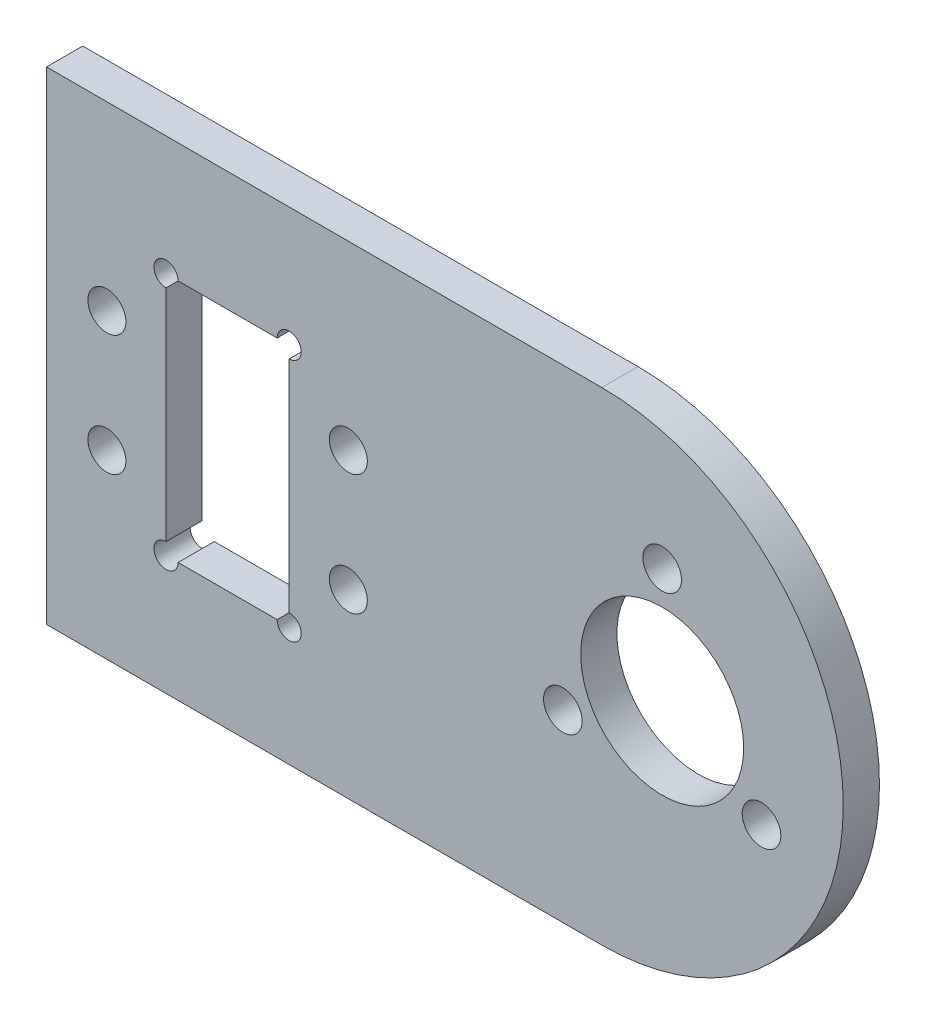
ISO-10303-21;
HEADER;
FILE_DESCRIPTION(('STEP AP214'),'2;1');
FILE_NAME('part.step','',(''),(''),'','','');
FILE_SCHEMA(('AUTOMOTIVE_DESIGN { 1 0 10303 214 1 1 1 1 }'));
ENDSEC;
DATA;
#1=APPLICATION_CONTEXT('core data for automotive mechanical design processes');
#2=APPLICATION_PROTOCOL_DEFINITION('international standard','automotive_design',2000,#1);
#3=PRODUCT_CONTEXT('',#1,'mechanical');
#4=PRODUCT('Part','Part','',(#3));
#5=PRODUCT_RELATED_PRODUCT_CATEGORY('part','',(#4));
#6=PRODUCT_DEFINITION_FORMATION('','',#4);
#7=PRODUCT_DEFINITION_CONTEXT('part definition',#1,'design');
#8=PRODUCT_DEFINITION('design','',#6,#7);
#9=PRODUCT_DEFINITION_SHAPE('','',#8);
#10=(LENGTH_UNIT() NAMED_UNIT(*) SI_UNIT(.MILLI.,.METRE.));
#11=(NAMED_UNIT(*) PLANE_ANGLE_UNIT() SI_UNIT($,.RADIAN.));
#12=(NAMED_UNIT(*) SI_UNIT($,.STERADIAN.) SOLID_ANGLE_UNIT());
#13=UNCERTAINTY_MEASURE_WITH_UNIT(LENGTH_MEASURE(1.E-05),#10,'distance_accuracy_value','');
#14=(GEOMETRIC_REPRESENTATION_CONTEXT(3) GLOBAL_UNCERTAINTY_ASSIGNED_CONTEXT((#13)) GLOBAL_UNIT_ASSIGNED_CONTEXT((#10,
#11,#12)) REPRESENTATION_CONTEXT('',''));
#15=CARTESIAN_POINT('',(0.,0.,0.));
#16=DIRECTION('',(0.,0.,1.));
#17=DIRECTION('',(1.,0.,0.));
#18=AXIS2_PLACEMENT_3D('',#15,#16,#17);
#19=CARTESIAN_POINT('',(0.,-20.,3.));
#20=DIRECTION('',(0.,0.,-1.));
#21=DIRECTION('',(-1.,0.,0.));
#22=AXIS2_PLACEMENT_3D('',#19,#20,#21);
#23=CYLINDRICAL_SURFACE('',#22,20.);
#24=CARTESIAN_POINT('',(0.,-20.,0.));
#25=DIRECTION('',(0.,0.,1.));
#26=DIRECTION('',(1.,0.,0.));
#27=AXIS2_PLACEMENT_3D('',#24,#25,#26);
#28=CIRCLE('',#27,20.);
#29=CARTESIAN_POINT('',(0.,-40.,0.));
#30=VERTEX_POINT('',#29);
#31=CARTESIAN_POINT('',(0.,0.,0.));
#32=VERTEX_POINT('',#31);
#33=EDGE_CURVE('E175',#30,#32,#28,.T.);
#34=ORIENTED_EDGE('',*,*,#33,.T.);
#35=DIRECTION('',(0.,0.,-1.));
#36=VECTOR('',#35,1.);
#37=CARTESIAN_POINT('',(0.,0.,3.));
#38=LINE('',#37,#36);
#39=CARTESIAN_POINT('',(0.,0.,3.));
#40=VERTEX_POINT('',#39);
#41=EDGE_CURVE('E192',#40,#32,#38,.T.);
#42=ORIENTED_EDGE('',*,*,#41,.F.);
#43=CARTESIAN_POINT('',(0.,-20.,3.));
#44=DIRECTION('',(0.,0.,1.));
#45=DIRECTION('',(1.,0.,0.));
#46=AXIS2_PLACEMENT_3D('',#43,#44,#45);
#47=CIRCLE('',#46,20.);
#48=CARTESIAN_POINT('',(0.,-40.,3.));
#49=VERTEX_POINT('',#48);
#50=EDGE_CURVE('E164',#49,#40,#47,.T.);
#51=ORIENTED_EDGE('',*,*,#50,.F.);
#52=DIRECTION('',(0.,0.,-1.));
#53=VECTOR('',#52,1.);
#54=CARTESIAN_POINT('',(0.,-40.,3.));
#55=LINE('',#54,#53);
#56=EDGE_CURVE('E174',#49,#30,#55,.T.);
#57=ORIENTED_EDGE('',*,*,#56,.T.);
#58=EDGE_LOOP('',(#34,#42,#51,#57));
#59=FACE_BOUND('',#58,.T.);
#60=ADVANCED_FACE('F40',(#59),#23,.T.);
#61=CARTESIAN_POINT('',(0.,0.,3.));
#62=DIRECTION('',(0.,-1.,0.));
#63=DIRECTION('',(1.,0.,0.));
#64=AXIS2_PLACEMENT_3D('',#61,#62,#63);
#65=PLANE('',#64);
#66=DIRECTION('',(-1.,0.,0.));
#67=VECTOR('',#66,1.);
#68=CARTESIAN_POINT('',(0.,0.,0.));
#69=LINE('',#68,#67);
#70=CARTESIAN_POINT('',(-46.,0.,0.));
#71=VERTEX_POINT('',#70);
#72=EDGE_CURVE('E178',#32,#71,#69,.T.);
#73=ORIENTED_EDGE('',*,*,#72,.T.);
#74=DIRECTION('',(0.,0.,-1.));
#75=VECTOR('',#74,1.);
#76=CARTESIAN_POINT('',(-46.,0.,3.));
#77=LINE('',#76,#75);
#78=CARTESIAN_POINT('',(-46.,0.,3.));
#79=VERTEX_POINT('',#78);
#80=EDGE_CURVE('E189',#79,#71,#77,.T.);
#81=ORIENTED_EDGE('',*,*,#80,.F.);
#82=DIRECTION('',(-1.,0.,0.));
#83=VECTOR('',#82,1.);
#84=CARTESIAN_POINT('',(0.,0.,3.));
#85=LINE('',#84,#83);
#86=EDGE_CURVE('E167',#40,#79,#85,.T.);
#87=ORIENTED_EDGE('',*,*,#86,.F.);
#88=ORIENTED_EDGE('',*,*,#41,.T.);
#89=EDGE_LOOP('',(#73,#81,#87,#88));
#90=FACE_BOUND('',#89,.T.);
#91=ADVANCED_FACE('F304',(#90),#65,.F.);
#92=CARTESIAN_POINT('',(-46.,0.,3.));
#93=DIRECTION('',(1.,0.,0.));
#94=DIRECTION('',(0.,0.,-1.));
#95=AXIS2_PLACEMENT_3D('',#92,#93,#94);
#96=PLANE('',#95);
#97=DIRECTION('',(0.,-1.,0.));
#98=VECTOR('',#97,1.);
#99=CARTESIAN_POINT('',(-46.,0.,0.));
#100=LINE('',#99,#98);
#101=CARTESIAN_POINT('',(-46.,-40.,0.));
#102=VERTEX_POINT('',#101);
#103=EDGE_CURVE('E181',#71,#102,#100,.T.);
#104=ORIENTED_EDGE('',*,*,#103,.T.);
#105=DIRECTION('',(0.,0.,-1.));
#106=VECTOR('',#105,1.);
#107=CARTESIAN_POINT('',(-46.,-40.,3.));
#108=LINE('',#107,#106);
#109=CARTESIAN_POINT('',(-46.,-40.,3.));
#110=VERTEX_POINT('',#109);
#111=EDGE_CURVE('E186',#110,#102,#108,.T.);
#112=ORIENTED_EDGE('',*,*,#111,.F.);
#113=DIRECTION('',(0.,-1.,0.));
#114=VECTOR('',#113,1.);
#115=CARTESIAN_POINT('',(-46.,0.,3.));
#116=LINE('',#115,#114);
#117=EDGE_CURVE('E170',#79,#110,#116,.T.);
#118=ORIENTED_EDGE('',*,*,#117,.F.);
#119=ORIENTED_EDGE('',*,*,#80,.T.);
#120=EDGE_LOOP('',(#104,#112,#118,#119));
#121=FACE_BOUND('',#120,.T.);
#122=ADVANCED_FACE('F309',(#121),#96,.F.);
#123=CARTESIAN_POINT('',(-46.,-40.,3.));
#124=DIRECTION('',(0.,1.,0.));
#125=DIRECTION('',(0.,0.,1.));
#126=AXIS2_PLACEMENT_3D('',#123,#124,#125);
#127=PLANE('',#126);
#128=DIRECTION('',(1.,0.,0.));
#129=VECTOR('',#128,1.);
#130=CARTESIAN_POINT('',(-46.,-40.,0.));
#131=LINE('',#130,#129);
#132=EDGE_CURVE('E168',#102,#30,#131,.T.);
#133=ORIENTED_EDGE('',*,*,#132,.T.);
#134=ORIENTED_EDGE('',*,*,#56,.F.);
#135=DIRECTION('',(1.,0.,0.));
#136=VECTOR('',#135,1.);
#137=CARTESIAN_POINT('',(-46.,-40.,3.));
#138=LINE('',#137,#136);
#139=EDGE_CURVE('E172',#110,#49,#138,.T.);
#140=ORIENTED_EDGE('',*,*,#139,.F.);
#141=ORIENTED_EDGE('',*,*,#111,.T.);
#142=EDGE_LOOP('',(#133,#134,#140,#141));
#143=FACE_BOUND('',#142,.T.);
#144=ADVANCED_FACE('F323',(#143),#127,.F.);
#145=CARTESIAN_POINT('',(0.,-20.,3.));
#146=DIRECTION('',(0.,0.,1.));
#147=DIRECTION('',(1.,0.,0.));
#148=AXIS2_PLACEMENT_3D('',#145,#146,#147);
#149=PLANE('',#148);
#150=CARTESIAN_POINT('',(-36.1,-9.9,3.));
#151=DIRECTION('',(0.,0.,1.));
#152=DIRECTION('',(1.,0.,0.));
#153=AXIS2_PLACEMENT_3D('',#150,#151,#152);
#154=CIRCLE('',#153,0.999999999999998);
#155=CARTESIAN_POINT('',(-35.1,-9.9,3.));
#156=VERTEX_POINT('',#155);
#157=CARTESIAN_POINT('',(-36.1,-10.9,3.));
#158=VERTEX_POINT('',#157);
#159=EDGE_CURVE('E282',#156,#158,#154,.T.);
#160=ORIENTED_EDGE('',*,*,#159,.F.);
#161=DIRECTION('',(-1.,0.,0.));
#162=VECTOR('',#161,1.);
#163=CARTESIAN_POINT('',(-36.1,-9.9,3.));
#164=LINE('',#163,#162);
#165=CARTESIAN_POINT('',(-26.9,-9.9,3.));
#166=VERTEX_POINT('',#165);
#167=EDGE_CURVE('E154',#166,#156,#164,.T.);
#168=ORIENTED_EDGE('',*,*,#167,.F.);
#169=CARTESIAN_POINT('',(-25.9,-9.9,3.));
#170=DIRECTION('',(0.,0.,1.));
#171=DIRECTION('',(1.,0.,0.));
#172=AXIS2_PLACEMENT_3D('',#169,#170,#171);
#173=CIRCLE('',#172,0.999999999999998);
#174=CARTESIAN_POINT('',(-25.9,-10.9,3.));
#175=VERTEX_POINT('',#174);
#176=EDGE_CURVE('E137',#175,#166,#173,.T.);
#177=ORIENTED_EDGE('',*,*,#176,.F.);
#178=DIRECTION('',(0.,1.,0.));
#179=VECTOR('',#178,1.);
#180=CARTESIAN_POINT('',(-25.9,-9.9,3.));
#181=LINE('',#180,#179);
#182=CARTESIAN_POINT('',(-25.9,-29.1,3.));
#183=VERTEX_POINT('',#182);
#184=EDGE_CURVE('E144',#183,#175,#181,.T.);
#185=ORIENTED_EDGE('',*,*,#184,.F.);
#186=CARTESIAN_POINT('',(-25.9,-30.1,3.));
#187=DIRECTION('',(0.,0.,1.));
#188=DIRECTION('',(1.,0.,0.));
#189=AXIS2_PLACEMENT_3D('',#186,#187,#188);
#190=CIRCLE('',#189,0.999999999999998);
#191=CARTESIAN_POINT('',(-26.9,-30.1,3.));
#192=VERTEX_POINT('',#191);
#193=EDGE_CURVE('E126',#192,#183,#190,.T.);
#194=ORIENTED_EDGE('',*,*,#193,.F.);
#195=DIRECTION('',(1.,0.,0.));
#196=VECTOR('',#195,1.);
#197=CARTESIAN_POINT('',(-36.1,-30.1,3.));
#198=LINE('',#197,#196);
#199=CARTESIAN_POINT('',(-35.1,-30.1,3.));
#200=VERTEX_POINT('',#199);
#201=EDGE_CURVE('E155',#200,#192,#198,.T.);
#202=ORIENTED_EDGE('',*,*,#201,.F.);
#203=CARTESIAN_POINT('',(-36.1,-30.1,3.));
#204=DIRECTION('',(0.,0.,1.));
#205=DIRECTION('',(1.,0.,0.));
#206=AXIS2_PLACEMENT_3D('',#203,#204,#205);
#207=CIRCLE('',#206,0.999999999999998);
#208=CARTESIAN_POINT('',(-36.1,-29.1,3.));
#209=VERTEX_POINT('',#208);
#210=EDGE_CURVE('E285',#209,#200,#207,.T.);
#211=ORIENTED_EDGE('',*,*,#210,.F.);
#212=DIRECTION('',(0.,-1.,0.));
#213=VECTOR('',#212,1.);
#214=CARTESIAN_POINT('',(-36.1,-9.9,3.));
#215=LINE('',#214,#213);
#216=EDGE_CURVE('E160',#158,#209,#215,.T.);
#217=ORIENTED_EDGE('',*,*,#216,.F.);
#218=EDGE_LOOP('',(#160,#168,#177,#185,#194,#202,#211,#217));
#219=FACE_BOUND('',#218,.T.);
#220=CARTESIAN_POINT('',(5.,-20.,3.));
#221=DIRECTION('',(0.,0.,1.));
#222=DIRECTION('',(1.,0.,0.));
#223=AXIS2_PLACEMENT_3D('',#220,#221,#222);
#224=CIRCLE('',#223,6.75);
#225=CARTESIAN_POINT('',(11.75,-20.,3.));
#226=VERTEX_POINT('',#225);
#227=EDGE_CURVE('E244',#226,#226,#224,.T.);
#228=ORIENTED_EDGE('',*,*,#227,.F.);
#229=EDGE_LOOP('',(#228));
#230=FACE_BOUND('',#229,.T.);
#231=CARTESIAN_POINT('',(5.,-10.5,3.));
#232=DIRECTION('',(0.,0.,1.));
#233=DIRECTION('',(1.,0.,0.));
#234=AXIS2_PLACEMENT_3D('',#231,#232,#233);
#235=CIRCLE('',#234,1.6);
#236=CARTESIAN_POINT('',(6.60000000000001,-10.5,3.));
#237=VERTEX_POINT('',#236);
#238=EDGE_CURVE('E263',#237,#237,#235,.T.);
#239=ORIENTED_EDGE('',*,*,#238,.F.);
#240=EDGE_LOOP('',(#239));
#241=FACE_BOUND('',#240,.T.);
#242=CARTESIAN_POINT('',(13.2272413359522,-24.75,3.));
#243=DIRECTION('',(0.,0.,1.));
#244=DIRECTION('',(1.,0.,0.));
#245=AXIS2_PLACEMENT_3D('',#242,#243,#244);
#246=CIRCLE('',#245,1.6);
#247=CARTESIAN_POINT('',(14.8272413359522,-24.75,3.));
#248=VERTEX_POINT('',#247);
#249=EDGE_CURVE('E245',#248,#248,#246,.T.);
#250=ORIENTED_EDGE('',*,*,#249,.F.);
#251=EDGE_LOOP('',(#250));
#252=FACE_BOUND('',#251,.T.);
#253=CARTESIAN_POINT('',(-3.22724133595216,-24.75,3.));
#254=DIRECTION('',(0.,0.,1.));
#255=DIRECTION('',(1.,0.,0.));
#256=AXIS2_PLACEMENT_3D('',#253,#254,#255);
#257=CIRCLE('',#256,1.6);
#258=CARTESIAN_POINT('',(-1.62724133595216,-24.75,3.));
#259=VERTEX_POINT('',#258);
#260=EDGE_CURVE('E252',#259,#259,#257,.T.);
#261=ORIENTED_EDGE('',*,*,#260,.F.);
#262=EDGE_LOOP('',(#261));
#263=FACE_BOUND('',#262,.T.);
#264=CARTESIAN_POINT('',(-21.,-15.,3.));
#265=DIRECTION('',(0.,0.,1.));
#266=DIRECTION('',(-1.,0.,0.));
#267=AXIS2_PLACEMENT_3D('',#264,#265,#266);
#268=CIRCLE('',#267,1.57500000000001);
#269=CARTESIAN_POINT('',(-22.575,-15.,3.));
#270=VERTEX_POINT('',#269);
#271=EDGE_CURVE('E238',#270,#270,#268,.T.);
#272=ORIENTED_EDGE('',*,*,#271,.F.);
#273=EDGE_LOOP('',(#272));
#274=FACE_BOUND('',#273,.T.);
#275=CARTESIAN_POINT('',(-21.,-25.,3.));
#276=DIRECTION('',(0.,0.,1.));
#277=DIRECTION('',(1.,0.,0.));
#278=AXIS2_PLACEMENT_3D('',#275,#276,#277);
#279=CIRCLE('',#278,1.57500000000001);
#280=CARTESIAN_POINT('',(-19.425,-25.,3.));
#281=VERTEX_POINT('',#280);
#282=EDGE_CURVE('E232',#281,#281,#279,.T.);
#283=ORIENTED_EDGE('',*,*,#282,.F.);
#284=EDGE_LOOP('',(#283));
#285=FACE_BOUND('',#284,.T.);
#286=CARTESIAN_POINT('',(-41.,-25.,3.));
#287=DIRECTION('',(0.,0.,1.));
#288=DIRECTION('',(-1.,0.,0.));
#289=AXIS2_PLACEMENT_3D('',#286,#287,#288);
#290=CIRCLE('',#289,1.57500000000001);
#291=CARTESIAN_POINT('',(-42.575,-25.,3.));
#292=VERTEX_POINT('',#291);
#293=EDGE_CURVE('E221',#292,#292,#290,.T.);
#294=ORIENTED_EDGE('',*,*,#293,.F.);
#295=EDGE_LOOP('',(#294));
#296=FACE_BOUND('',#295,.T.);
#297=CARTESIAN_POINT('',(-41.,-15.,3.));
#298=DIRECTION('',(0.,0.,1.));
#299=DIRECTION('',(1.,0.,0.));
#300=AXIS2_PLACEMENT_3D('',#297,#298,#299);
#301=CIRCLE('',#300,1.57500000000001);
#302=CARTESIAN_POINT('',(-39.425,-15.,3.));
#303=VERTEX_POINT('',#302);
#304=EDGE_CURVE('E210',#303,#303,#301,.T.);
#305=ORIENTED_EDGE('',*,*,#304,.F.);
#306=EDGE_LOOP('',(#305));
#307=FACE_BOUND('',#306,.T.);
#308=ORIENTED_EDGE('',*,*,#50,.T.);
#309=ORIENTED_EDGE('',*,*,#86,.T.);
#310=ORIENTED_EDGE('',*,*,#117,.T.);
#311=ORIENTED_EDGE('',*,*,#139,.T.);
#312=EDGE_LOOP('',(#308,#309,#310,#311));
#313=FACE_BOUND('',#312,.T.);
#314=ADVANCED_FACE('F151',(#219,#230,#241,#252,#263,#274,#285,#296,#307,#313),#149,.T.);
#315=CARTESIAN_POINT('',(0.,-20.,0.));
#316=DIRECTION('',(0.,0.,1.));
#317=DIRECTION('',(1.,0.,0.));
#318=AXIS2_PLACEMENT_3D('',#315,#316,#317);
#319=PLANE('',#318);
#320=CARTESIAN_POINT('',(5.,-20.,0.));
#321=DIRECTION('',(0.,0.,1.));
#322=DIRECTION('',(1.,0.,0.));
#323=AXIS2_PLACEMENT_3D('',#320,#321,#322);
#324=CIRCLE('',#323,6.75);
#325=CARTESIAN_POINT('',(11.75,-20.,0.));
#326=VERTEX_POINT('',#325);
#327=EDGE_CURVE('E260',#326,#326,#324,.T.);
#328=ORIENTED_EDGE('',*,*,#327,.T.);
#329=EDGE_LOOP('',(#328));
#330=FACE_BOUND('',#329,.T.);
#331=CARTESIAN_POINT('',(5.,-10.5,0.));
#332=DIRECTION('',(0.,0.,1.));
#333=DIRECTION('',(1.,0.,0.));
#334=AXIS2_PLACEMENT_3D('',#331,#332,#333);
#335=CIRCLE('',#334,1.6);
#336=CARTESIAN_POINT('',(6.60000000000001,-10.5,0.));
#337=VERTEX_POINT('',#336);
#338=EDGE_CURVE('E248',#337,#337,#335,.T.);
#339=ORIENTED_EDGE('',*,*,#338,.T.);
#340=EDGE_LOOP('',(#339));
#341=FACE_BOUND('',#340,.T.);
#342=CARTESIAN_POINT('',(13.2272413359522,-24.75,0.));
#343=DIRECTION('',(0.,0.,1.));
#344=DIRECTION('',(1.,0.,0.));
#345=AXIS2_PLACEMENT_3D('',#342,#343,#344);
#346=CIRCLE('',#345,1.6);
#347=CARTESIAN_POINT('',(14.8272413359522,-24.75,0.));
#348=VERTEX_POINT('',#347);
#349=EDGE_CURVE('E249',#348,#348,#346,.T.);
#350=ORIENTED_EDGE('',*,*,#349,.T.);
#351=EDGE_LOOP('',(#350));
#352=FACE_BOUND('',#351,.T.);
#353=CARTESIAN_POINT('',(-3.22724133595216,-24.75,0.));
#354=DIRECTION('',(0.,0.,1.));
#355=DIRECTION('',(1.,0.,0.));
#356=AXIS2_PLACEMENT_3D('',#353,#354,#355);
#357=CIRCLE('',#356,1.6);
#358=CARTESIAN_POINT('',(-1.62724133595216,-24.75,0.));
#359=VERTEX_POINT('',#358);
#360=EDGE_CURVE('E255',#359,#359,#357,.T.);
#361=ORIENTED_EDGE('',*,*,#360,.T.);
#362=EDGE_LOOP('',(#361));
#363=FACE_BOUND('',#362,.T.);
#364=CARTESIAN_POINT('',(-21.,-15.,0.));
#365=DIRECTION('',(0.,0.,1.));
#366=DIRECTION('',(-1.,0.,0.));
#367=AXIS2_PLACEMENT_3D('',#364,#365,#366);
#368=CIRCLE('',#367,1.57500000000001);
#369=CARTESIAN_POINT('',(-22.575,-15.,0.));
#370=VERTEX_POINT('',#369);
#371=EDGE_CURVE('E241',#370,#370,#368,.T.);
#372=ORIENTED_EDGE('',*,*,#371,.T.);
#373=EDGE_LOOP('',(#372));
#374=FACE_BOUND('',#373,.T.);
#375=CARTESIAN_POINT('',(-21.,-25.,0.));
#376=DIRECTION('',(0.,0.,1.));
#377=DIRECTION('',(1.,0.,0.));
#378=AXIS2_PLACEMENT_3D('',#375,#376,#377);
#379=CIRCLE('',#378,1.57500000000001);
#380=CARTESIAN_POINT('',(-19.425,-25.,0.));
#381=VERTEX_POINT('',#380);
#382=EDGE_CURVE('E235',#381,#381,#379,.T.);
#383=ORIENTED_EDGE('',*,*,#382,.T.);
#384=EDGE_LOOP('',(#383));
#385=FACE_BOUND('',#384,.T.);
#386=CARTESIAN_POINT('',(-41.,-25.,0.));
#387=DIRECTION('',(0.,0.,1.));
#388=DIRECTION('',(-1.,0.,0.));
#389=AXIS2_PLACEMENT_3D('',#386,#387,#388);
#390=CIRCLE('',#389,1.57500000000001);
#391=CARTESIAN_POINT('',(-42.575,-25.,0.));
#392=VERTEX_POINT('',#391);
#393=EDGE_CURVE('E229',#392,#392,#390,.T.);
#394=ORIENTED_EDGE('',*,*,#393,.T.);
#395=EDGE_LOOP('',(#394));
#396=FACE_BOUND('',#395,.T.);
#397=CARTESIAN_POINT('',(-41.,-15.,0.));
#398=DIRECTION('',(0.,0.,1.));
#399=DIRECTION('',(1.,0.,0.));
#400=AXIS2_PLACEMENT_3D('',#397,#398,#399);
#401=CIRCLE('',#400,1.57500000000001);
#402=CARTESIAN_POINT('',(-39.425,-15.,0.));
#403=VERTEX_POINT('',#402);
#404=EDGE_CURVE('E216',#403,#403,#401,.T.);
#405=ORIENTED_EDGE('',*,*,#404,.T.);
#406=EDGE_LOOP('',(#405));
#407=FACE_BOUND('',#406,.T.);
#408=DIRECTION('',(-1.,0.,0.));
#409=VECTOR('',#408,1.);
#410=CARTESIAN_POINT('',(-36.1,-9.9,0.));
#411=LINE('',#410,#409);
#412=CARTESIAN_POINT('',(-26.9,-9.9,0.));
#413=VERTEX_POINT('',#412);
#414=CARTESIAN_POINT('',(-35.1,-9.9,0.));
#415=VERTEX_POINT('',#414);
#416=EDGE_CURVE('E179',#413,#415,#411,.T.);
#417=ORIENTED_EDGE('',*,*,#416,.T.);
#418=CARTESIAN_POINT('',(-36.1,-9.9,0.));
#419=DIRECTION('',(0.,0.,1.));
#420=DIRECTION('',(1.,0.,0.));
#421=AXIS2_PLACEMENT_3D('',#418,#419,#420);
#422=CIRCLE('',#421,0.999999999999998);
#423=CARTESIAN_POINT('',(-36.1,-10.9,0.));
#424=VERTEX_POINT('',#423);
#425=EDGE_CURVE('E54',#415,#424,#422,.T.);
#426=ORIENTED_EDGE('',*,*,#425,.T.);
#427=DIRECTION('',(0.,-1.,0.));
#428=VECTOR('',#427,1.);
#429=CARTESIAN_POINT('',(-36.1,-9.9,0.));
#430=LINE('',#429,#428);
#431=CARTESIAN_POINT('',(-36.1,-29.1,0.));
#432=VERTEX_POINT('',#431);
#433=EDGE_CURVE('E158',#424,#432,#430,.T.);
#434=ORIENTED_EDGE('',*,*,#433,.T.);
#435=CARTESIAN_POINT('',(-36.1,-30.1,0.));
#436=DIRECTION('',(0.,0.,1.));
#437=DIRECTION('',(1.,0.,0.));
#438=AXIS2_PLACEMENT_3D('',#435,#436,#437);
#439=CIRCLE('',#438,0.999999999999998);
#440=CARTESIAN_POINT('',(-35.1,-30.1,0.));
#441=VERTEX_POINT('',#440);
#442=EDGE_CURVE('E270',#432,#441,#439,.T.);
#443=ORIENTED_EDGE('',*,*,#442,.T.);
#444=DIRECTION('',(1.,0.,0.));
#445=VECTOR('',#444,1.);
#446=CARTESIAN_POINT('',(-36.1,-30.1,0.));
#447=LINE('',#446,#445);
#448=CARTESIAN_POINT('',(-26.9,-30.1,0.));
#449=VERTEX_POINT('',#448);
#450=EDGE_CURVE('E204',#441,#449,#447,.T.);
#451=ORIENTED_EDGE('',*,*,#450,.T.);
#452=CARTESIAN_POINT('',(-25.9,-30.1,0.));
#453=DIRECTION('',(0.,0.,1.));
#454=DIRECTION('',(1.,0.,0.));
#455=AXIS2_PLACEMENT_3D('',#452,#453,#454);
#456=CIRCLE('',#455,0.999999999999998);
#457=CARTESIAN_POINT('',(-25.9,-29.1,0.));
#458=VERTEX_POINT('',#457);
#459=EDGE_CURVE('E138',#449,#458,#456,.T.);
#460=ORIENTED_EDGE('',*,*,#459,.T.);
#461=DIRECTION('',(0.,1.,0.));
#462=VECTOR('',#461,1.);
#463=CARTESIAN_POINT('',(-25.9,-9.9,0.));
#464=LINE('',#463,#462);
#465=CARTESIAN_POINT('',(-25.9,-10.9,0.));
#466=VERTEX_POINT('',#465);
#467=EDGE_CURVE('E146',#458,#466,#464,.T.);
#468=ORIENTED_EDGE('',*,*,#467,.T.);
#469=CARTESIAN_POINT('',(-25.9,-9.9,0.));
#470=DIRECTION('',(0.,0.,1.));
#471=DIRECTION('',(1.,0.,0.));
#472=AXIS2_PLACEMENT_3D('',#469,#470,#471);
#473=CIRCLE('',#472,0.999999999999998);
#474=EDGE_CURVE('E61',#466,#413,#473,.T.);
#475=ORIENTED_EDGE('',*,*,#474,.T.);
#476=EDGE_LOOP('',(#417,#426,#434,#443,#451,#460,#468,#475));
#477=FACE_BOUND('',#476,.T.);
#478=ORIENTED_EDGE('',*,*,#33,.F.);
#479=ORIENTED_EDGE('',*,*,#132,.F.);
#480=ORIENTED_EDGE('',*,*,#103,.F.);
#481=ORIENTED_EDGE('',*,*,#72,.F.);
#482=EDGE_LOOP('',(#478,#479,#480,#481));
#483=FACE_BOUND('',#482,.T.);
#484=ADVANCED_FACE('F200',(#330,#341,#352,#363,#374,#385,#396,#407,#477,#483),#319,.F.);
#485=CARTESIAN_POINT('',(-36.1,-9.9,0.));
#486=DIRECTION('',(-1.,0.,0.));
#487=DIRECTION('',(0.,0.,1.));
#488=AXIS2_PLACEMENT_3D('',#485,#486,#487);
#489=PLANE('',#488);
#490=ORIENTED_EDGE('',*,*,#433,.F.);
#491=DIRECTION('',(0.,0.,1.));
#492=VECTOR('',#491,1.);
#493=CARTESIAN_POINT('',(-36.1,-10.9,0.));
#494=LINE('',#493,#492);
#495=EDGE_CURVE('E224',#424,#158,#494,.T.);
#496=ORIENTED_EDGE('',*,*,#495,.T.);
#497=ORIENTED_EDGE('',*,*,#216,.T.);
#498=DIRECTION('',(0.,0.,1.));
#499=VECTOR('',#498,1.);
#500=CARTESIAN_POINT('',(-36.1,-29.1,0.));
#501=LINE('',#500,#499);
#502=EDGE_CURVE('E147',#209,#432,#501,.F.);
#503=ORIENTED_EDGE('',*,*,#502,.T.);
#504=EDGE_LOOP('',(#490,#496,#497,#503));
#505=FACE_BOUND('',#504,.T.);
#506=ADVANCED_FACE('F272',(#505),#489,.F.);
#507=CARTESIAN_POINT('',(-36.1,-9.9,0.));
#508=DIRECTION('',(0.,1.,0.));
#509=DIRECTION('',(-1.,0.,0.));
#510=AXIS2_PLACEMENT_3D('',#507,#508,#509);
#511=PLANE('',#510);
#512=ORIENTED_EDGE('',*,*,#167,.T.);
#513=DIRECTION('',(0.,0.,1.));
#514=VECTOR('',#513,1.);
#515=CARTESIAN_POINT('',(-35.1,-9.9,0.));
#516=LINE('',#515,#514);
#517=EDGE_CURVE('E11',#156,#415,#516,.F.);
#518=ORIENTED_EDGE('',*,*,#517,.T.);
#519=ORIENTED_EDGE('',*,*,#416,.F.);
#520=DIRECTION('',(0.,0.,1.));
#521=VECTOR('',#520,1.);
#522=CARTESIAN_POINT('',(-26.9,-9.9,0.));
#523=LINE('',#522,#521);
#524=EDGE_CURVE('E275',#413,#166,#523,.T.);
#525=ORIENTED_EDGE('',*,*,#524,.T.);
#526=EDGE_LOOP('',(#512,#518,#519,#525));
#527=FACE_BOUND('',#526,.T.);
#528=ADVANCED_FACE('F300',(#527),#511,.F.);
#529=CARTESIAN_POINT('',(-25.9,-9.9,0.));
#530=DIRECTION('',(1.,0.,0.));
#531=DIRECTION('',(0.,1.,0.));
#532=AXIS2_PLACEMENT_3D('',#529,#530,#531);
#533=PLANE('',#532);
#534=ORIENTED_EDGE('',*,*,#467,.F.);
#535=DIRECTION('',(0.,0.,1.));
#536=VECTOR('',#535,1.);
#537=CARTESIAN_POINT('',(-25.9,-29.1,0.));
#538=LINE('',#537,#536);
#539=EDGE_CURVE('E129',#458,#183,#538,.T.);
#540=ORIENTED_EDGE('',*,*,#539,.T.);
#541=ORIENTED_EDGE('',*,*,#184,.T.);
#542=DIRECTION('',(0.,0.,1.));
#543=VECTOR('',#542,1.);
#544=CARTESIAN_POINT('',(-25.9,-10.9,0.));
#545=LINE('',#544,#543);
#546=EDGE_CURVE('E47',#175,#466,#545,.F.);
#547=ORIENTED_EDGE('',*,*,#546,.T.);
#548=EDGE_LOOP('',(#534,#540,#541,#547));
#549=FACE_BOUND('',#548,.T.);
#550=ADVANCED_FACE('F143',(#549),#533,.F.);
#551=CARTESIAN_POINT('',(-36.1,-30.1,0.));
#552=DIRECTION('',(0.,-1.,0.));
#553=DIRECTION('',(0.,0.,-1.));
#554=AXIS2_PLACEMENT_3D('',#551,#552,#553);
#555=PLANE('',#554);
#556=ORIENTED_EDGE('',*,*,#450,.F.);
#557=DIRECTION('',(0.,0.,1.));
#558=VECTOR('',#557,1.);
#559=CARTESIAN_POINT('',(-35.1,-30.1,0.));
#560=LINE('',#559,#558);
#561=EDGE_CURVE('E196',#441,#200,#560,.T.);
#562=ORIENTED_EDGE('',*,*,#561,.T.);
#563=ORIENTED_EDGE('',*,*,#201,.T.);
#564=DIRECTION('',(0.,0.,1.));
#565=VECTOR('',#564,1.);
#566=CARTESIAN_POINT('',(-26.9,-30.1,0.));
#567=LINE('',#566,#565);
#568=EDGE_CURVE('E132',#192,#449,#567,.F.);
#569=ORIENTED_EDGE('',*,*,#568,.T.);
#570=EDGE_LOOP('',(#556,#562,#563,#569));
#571=FACE_BOUND('',#570,.T.);
#572=ADVANCED_FACE('F289',(#571),#555,.F.);
#573=CARTESIAN_POINT('',(-41.,-15.,0.));
#574=DIRECTION('',(0.,0.,1.));
#575=DIRECTION('',(1.,0.,0.));
#576=AXIS2_PLACEMENT_3D('',#573,#574,#575);
#577=CYLINDRICAL_SURFACE('',#576,1.57500000000001);
#578=ORIENTED_EDGE('',*,*,#404,.F.);
#579=EDGE_LOOP('',(#578));
#580=FACE_BOUND('',#579,.T.);
#581=ORIENTED_EDGE('',*,*,#304,.T.);
#582=EDGE_LOOP('',(#581));
#583=FACE_BOUND('',#582,.T.);
#584=ADVANCED_FACE('F291',(#580,#583),#577,.F.);
#585=CARTESIAN_POINT('',(-41.,-25.,0.));
#586=DIRECTION('',(0.,0.,1.));
#587=DIRECTION('',(1.,0.,0.));
#588=AXIS2_PLACEMENT_3D('',#585,#586,#587);
#589=CYLINDRICAL_SURFACE('',#588,1.57500000000001);
#590=ORIENTED_EDGE('',*,*,#393,.F.);
#591=EDGE_LOOP('',(#590));
#592=FACE_BOUND('',#591,.T.);
#593=ORIENTED_EDGE('',*,*,#293,.T.);
#594=EDGE_LOOP('',(#593));
#595=FACE_BOUND('',#594,.T.);
#596=ADVANCED_FACE('F297',(#592,#595),#589,.F.);
#597=CARTESIAN_POINT('',(-21.,-25.,0.));
#598=DIRECTION('',(0.,0.,1.));
#599=DIRECTION('',(1.,0.,0.));
#600=AXIS2_PLACEMENT_3D('',#597,#598,#599);
#601=CYLINDRICAL_SURFACE('',#600,1.57500000000001);
#602=ORIENTED_EDGE('',*,*,#382,.F.);
#603=EDGE_LOOP('',(#602));
#604=FACE_BOUND('',#603,.T.);
#605=ORIENTED_EDGE('',*,*,#282,.T.);
#606=EDGE_LOOP('',(#605));
#607=FACE_BOUND('',#606,.T.);
#608=ADVANCED_FACE('F364',(#604,#607),#601,.F.);
#609=CARTESIAN_POINT('',(-21.,-15.,0.));
#610=DIRECTION('',(0.,0.,1.));
#611=DIRECTION('',(1.,0.,0.));
#612=AXIS2_PLACEMENT_3D('',#609,#610,#611);
#613=CYLINDRICAL_SURFACE('',#612,1.57500000000001);
#614=ORIENTED_EDGE('',*,*,#371,.F.);
#615=EDGE_LOOP('',(#614));
#616=FACE_BOUND('',#615,.T.);
#617=ORIENTED_EDGE('',*,*,#271,.T.);
#618=EDGE_LOOP('',(#617));
#619=FACE_BOUND('',#618,.T.);
#620=ADVANCED_FACE('F357',(#616,#619),#613,.F.);
#621=CARTESIAN_POINT('',(-3.22724133595216,-24.75,0.));
#622=DIRECTION('',(0.,0.,1.));
#623=DIRECTION('',(1.,0.,0.));
#624=AXIS2_PLACEMENT_3D('',#621,#622,#623);
#625=CYLINDRICAL_SURFACE('',#624,1.6);
#626=ORIENTED_EDGE('',*,*,#360,.F.);
#627=EDGE_LOOP('',(#626));
#628=FACE_BOUND('',#627,.T.);
#629=ORIENTED_EDGE('',*,*,#260,.T.);
#630=EDGE_LOOP('',(#629));
#631=FACE_BOUND('',#630,.T.);
#632=ADVANCED_FACE('F354',(#628,#631),#625,.F.);
#633=CARTESIAN_POINT('',(13.2272413359522,-24.75,0.));
#634=DIRECTION('',(0.,0.,1.));
#635=DIRECTION('',(1.,0.,0.));
#636=AXIS2_PLACEMENT_3D('',#633,#634,#635);
#637=CYLINDRICAL_SURFACE('',#636,1.6);
#638=ORIENTED_EDGE('',*,*,#349,.F.);
#639=EDGE_LOOP('',(#638));
#640=FACE_BOUND('',#639,.T.);
#641=ORIENTED_EDGE('',*,*,#249,.T.);
#642=EDGE_LOOP('',(#641));
#643=FACE_BOUND('',#642,.T.);
#644=ADVANCED_FACE('F349',(#640,#643),#637,.F.);
#645=CARTESIAN_POINT('',(5.,-10.5,0.));
#646=DIRECTION('',(0.,0.,1.));
#647=DIRECTION('',(1.,0.,0.));
#648=AXIS2_PLACEMENT_3D('',#645,#646,#647);
#649=CYLINDRICAL_SURFACE('',#648,1.6);
#650=ORIENTED_EDGE('',*,*,#338,.F.);
#651=EDGE_LOOP('',(#650));
#652=FACE_BOUND('',#651,.T.);
#653=ORIENTED_EDGE('',*,*,#238,.T.);
#654=EDGE_LOOP('',(#653));
#655=FACE_BOUND('',#654,.T.);
#656=ADVANCED_FACE('F345',(#652,#655),#649,.F.);
#657=CARTESIAN_POINT('',(5.,-20.,0.));
#658=DIRECTION('',(0.,0.,1.));
#659=DIRECTION('',(1.,0.,0.));
#660=AXIS2_PLACEMENT_3D('',#657,#658,#659);
#661=CYLINDRICAL_SURFACE('',#660,6.75);
#662=ORIENTED_EDGE('',*,*,#327,.F.);
#663=EDGE_LOOP('',(#662));
#664=FACE_BOUND('',#663,.T.);
#665=ORIENTED_EDGE('',*,*,#227,.T.);
#666=EDGE_LOOP('',(#665));
#667=FACE_BOUND('',#666,.T.);
#668=ADVANCED_FACE('F348',(#664,#667),#661,.F.);
#669=CARTESIAN_POINT('',(-25.9,-30.1,0.));
#670=DIRECTION('',(0.,0.,1.));
#671=DIRECTION('',(1.,0.,0.));
#672=AXIS2_PLACEMENT_3D('',#669,#670,#671);
#673=CYLINDRICAL_SURFACE('',#672,0.999999999999998);
#674=ORIENTED_EDGE('',*,*,#459,.F.);
#675=ORIENTED_EDGE('',*,*,#568,.F.);
#676=ORIENTED_EDGE('',*,*,#193,.T.);
#677=ORIENTED_EDGE('',*,*,#539,.F.);
#678=EDGE_LOOP('',(#674,#675,#676,#677));
#679=FACE_BOUND('',#678,.T.);
#680=ADVANCED_FACE('F128',(#679),#673,.F.);
#681=CARTESIAN_POINT('',(-36.1,-30.1,0.));
#682=DIRECTION('',(0.,0.,1.));
#683=DIRECTION('',(1.,0.,0.));
#684=AXIS2_PLACEMENT_3D('',#681,#682,#683);
#685=CYLINDRICAL_SURFACE('',#684,0.999999999999998);
#686=ORIENTED_EDGE('',*,*,#210,.T.);
#687=ORIENTED_EDGE('',*,*,#561,.F.);
#688=ORIENTED_EDGE('',*,*,#442,.F.);
#689=ORIENTED_EDGE('',*,*,#502,.F.);
#690=EDGE_LOOP('',(#686,#687,#688,#689));
#691=FACE_BOUND('',#690,.T.);
#692=ADVANCED_FACE('F287',(#691),#685,.F.);
#693=CARTESIAN_POINT('',(-25.9,-9.9,0.));
#694=DIRECTION('',(0.,0.,1.));
#695=DIRECTION('',(1.,0.,0.));
#696=AXIS2_PLACEMENT_3D('',#693,#694,#695);
#697=CYLINDRICAL_SURFACE('',#696,0.999999999999998);
#698=ORIENTED_EDGE('',*,*,#474,.F.);
#699=ORIENTED_EDGE('',*,*,#546,.F.);
#700=ORIENTED_EDGE('',*,*,#176,.T.);
#701=ORIENTED_EDGE('',*,*,#524,.F.);
#702=EDGE_LOOP('',(#698,#699,#700,#701));
#703=FACE_BOUND('',#702,.T.);
#704=ADVANCED_FACE('F372',(#703),#697,.F.);
#705=CARTESIAN_POINT('',(-36.1,-9.9,0.));
#706=DIRECTION('',(0.,0.,1.));
#707=DIRECTION('',(1.,0.,0.));
#708=AXIS2_PLACEMENT_3D('',#705,#706,#707);
#709=CYLINDRICAL_SURFACE('',#708,0.999999999999998);
#710=ORIENTED_EDGE('',*,*,#425,.F.);
#711=ORIENTED_EDGE('',*,*,#517,.F.);
#712=ORIENTED_EDGE('',*,*,#159,.T.);
#713=ORIENTED_EDGE('',*,*,#495,.F.);
#714=EDGE_LOOP('',(#710,#711,#712,#713));
#715=FACE_BOUND('',#714,.T.);
#716=ADVANCED_FACE('F375',(#715),#709,.F.);
#717=CLOSED_SHELL('',(#60,#91,#122,#144,#314,#484,#506,#528,#550,#572,#584,#596,#608,#620,#632,
#644,#656,#668,#680,#692,#704,#716));
#718=MANIFOLD_SOLID_BREP('B2',#717);
#719=ADVANCED_BREP_SHAPE_REPRESENTATION('',(#18,#718),#14);
#720=SHAPE_DEFINITION_REPRESENTATION(#9,#719);
ENDSEC;
END-ISO-10303-21;
